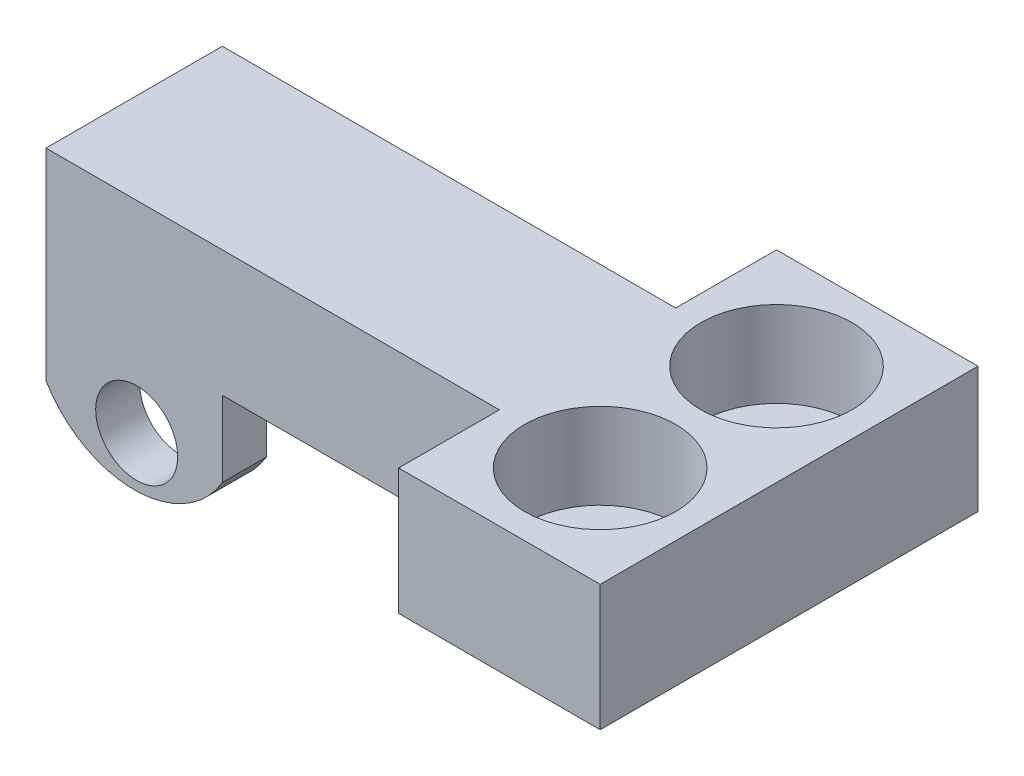
ISO-10303-21;
HEADER;
FILE_DESCRIPTION(('STEP AP214'),'2;1');
FILE_NAME('part.step','',(''),(''),'','','');
FILE_SCHEMA(('AUTOMOTIVE_DESIGN { 1 0 10303 214 1 1 1 1 }'));
ENDSEC;
DATA;
#1=APPLICATION_CONTEXT('core data for automotive mechanical design processes');
#2=APPLICATION_PROTOCOL_DEFINITION('international standard','automotive_design',2000,#1);
#3=PRODUCT_CONTEXT('',#1,'mechanical');
#4=PRODUCT('Part','Part','',(#3));
#5=PRODUCT_RELATED_PRODUCT_CATEGORY('part','',(#4));
#6=PRODUCT_DEFINITION_FORMATION('','',#4);
#7=PRODUCT_DEFINITION_CONTEXT('part definition',#1,'design');
#8=PRODUCT_DEFINITION('design','',#6,#7);
#9=PRODUCT_DEFINITION_SHAPE('','',#8);
#10=(LENGTH_UNIT() NAMED_UNIT(*) SI_UNIT(.MILLI.,.METRE.));
#11=(NAMED_UNIT(*) PLANE_ANGLE_UNIT() SI_UNIT($,.RADIAN.));
#12=(NAMED_UNIT(*) SI_UNIT($,.STERADIAN.) SOLID_ANGLE_UNIT());
#13=UNCERTAINTY_MEASURE_WITH_UNIT(LENGTH_MEASURE(1.E-05),#10,'distance_accuracy_value','');
#14=(GEOMETRIC_REPRESENTATION_CONTEXT(3) GLOBAL_UNCERTAINTY_ASSIGNED_CONTEXT((#13)) GLOBAL_UNIT_ASSIGNED_CONTEXT((#10,
#11,#12)) REPRESENTATION_CONTEXT('',''));
#15=CARTESIAN_POINT('',(0.,0.,0.));
#16=DIRECTION('',(0.,0.,1.));
#17=DIRECTION('',(1.,0.,0.));
#18=AXIS2_PLACEMENT_3D('',#15,#16,#17);
#19=CARTESIAN_POINT('',(-26.,0.,15.));
#20=DIRECTION('',(1.,0.,0.));
#21=DIRECTION('',(0.,0.,-1.));
#22=AXIS2_PLACEMENT_3D('',#19,#20,#21);
#23=PLANE('',#22);
#24=DIRECTION('',(0.,0.,-1.));
#25=VECTOR('',#24,1.);
#26=CARTESIAN_POINT('',(-26.,-3.00000000000001,15.));
#27=LINE('',#26,#25);
#28=CARTESIAN_POINT('',(-26.,-3.,11.));
#29=VERTEX_POINT('',#28);
#30=CARTESIAN_POINT('',(-26.,-3.00000000000001,9.25));
#31=VERTEX_POINT('',#30);
#32=EDGE_CURVE('E188',#29,#31,#27,.T.);
#33=ORIENTED_EDGE('',*,*,#32,.F.);
#34=DIRECTION('',(0.,-1.,0.));
#35=VECTOR('',#34,1.);
#36=CARTESIAN_POINT('',(-26.,5.,11.));
#37=LINE('',#36,#35);
#38=CARTESIAN_POINT('',(-26.,5.,11.));
#39=VERTEX_POINT('',#38);
#40=EDGE_CURVE('E148',#39,#29,#37,.T.);
#41=ORIENTED_EDGE('',*,*,#40,.F.);
#42=DIRECTION('',(0.,0.,-1.));
#43=VECTOR('',#42,1.);
#44=CARTESIAN_POINT('',(-26.,5.,15.));
#45=LINE('',#44,#43);
#46=CARTESIAN_POINT('',(-26.,5.,4.));
#47=VERTEX_POINT('',#46);
#48=EDGE_CURVE('E190',#39,#47,#45,.T.);
#49=ORIENTED_EDGE('',*,*,#48,.T.);
#50=DIRECTION('',(0.,-1.,0.));
#51=VECTOR('',#50,1.);
#52=CARTESIAN_POINT('',(-26.,5.,4.));
#53=LINE('',#52,#51);
#54=CARTESIAN_POINT('',(-26.,-3.00000000000001,4.));
#55=VERTEX_POINT('',#54);
#56=EDGE_CURVE('E237',#47,#55,#53,.T.);
#57=ORIENTED_EDGE('',*,*,#56,.T.);
#58=CARTESIAN_POINT('',(-26.,-3.00000000000001,5.75));
#59=VERTEX_POINT('',#58);
#60=EDGE_CURVE('E187',#59,#55,#27,.T.);
#61=ORIENTED_EDGE('',*,*,#60,.F.);
#62=DIRECTION('',(0.,1.,0.));
#63=VECTOR('',#62,1.);
#64=CARTESIAN_POINT('',(-26.,-5.,5.75));
#65=LINE('',#64,#63);
#66=CARTESIAN_POINT('',(-26.,0.,5.75));
#67=VERTEX_POINT('',#66);
#68=EDGE_CURVE('E200',#59,#67,#65,.T.);
#69=ORIENTED_EDGE('',*,*,#68,.T.);
#70=DIRECTION('',(0.,0.,-1.));
#71=VECTOR('',#70,1.);
#72=CARTESIAN_POINT('',(-26.,0.,5.75));
#73=LINE('',#72,#71);
#74=CARTESIAN_POINT('',(-26.,0.,9.25));
#75=VERTEX_POINT('',#74);
#76=EDGE_CURVE('E254',#75,#67,#73,.T.);
#77=ORIENTED_EDGE('',*,*,#76,.F.);
#78=DIRECTION('',(0.,1.,0.));
#79=VECTOR('',#78,1.);
#80=CARTESIAN_POINT('',(-26.,-5.,9.25));
#81=LINE('',#80,#79);
#82=EDGE_CURVE('E262',#31,#75,#81,.T.);
#83=ORIENTED_EDGE('',*,*,#82,.F.);
#84=EDGE_LOOP('',(#33,#41,#49,#57,#61,#69,#77,#83));
#85=FACE_BOUND('',#84,.T.);
#86=ADVANCED_FACE('F36',(#85),#23,.F.);
#87=CARTESIAN_POINT('',(-22.5,-0.937500000000003,15.));
#88=DIRECTION('',(0.,0.,-1.));
#89=DIRECTION('',(-1.,0.,0.));
#90=AXIS2_PLACEMENT_3D('',#87,#88,#89);
#91=CYLINDRICAL_SURFACE('',#90,4.0625);
#92=ORIENTED_EDGE('',*,*,#60,.T.);
#93=CARTESIAN_POINT('',(-22.5,-0.937500000000003,4.));
#94=DIRECTION('',(0.,0.,1.));
#95=DIRECTION('',(1.,0.,0.));
#96=AXIS2_PLACEMENT_3D('',#93,#94,#95);
#97=CIRCLE('',#96,4.0625);
#98=CARTESIAN_POINT('',(-19.,-3.,4.));
#99=VERTEX_POINT('',#98);
#100=EDGE_CURVE('E243',#55,#99,#97,.T.);
#101=ORIENTED_EDGE('',*,*,#100,.T.);
#102=DIRECTION('',(0.,0.,-1.));
#103=VECTOR('',#102,1.);
#104=CARTESIAN_POINT('',(-19.,-3.,15.));
#105=LINE('',#104,#103);
#106=CARTESIAN_POINT('',(-19.,-3.,5.75));
#107=VERTEX_POINT('',#106);
#108=EDGE_CURVE('E184',#107,#99,#105,.T.);
#109=ORIENTED_EDGE('',*,*,#108,.F.);
#110=CARTESIAN_POINT('',(-22.5,-0.937500000000003,5.75));
#111=DIRECTION('',(0.,0.,1.));
#112=DIRECTION('',(1.,0.,0.));
#113=AXIS2_PLACEMENT_3D('',#110,#111,#112);
#114=CIRCLE('',#113,4.0625);
#115=EDGE_CURVE('E175',#59,#107,#114,.T.);
#116=ORIENTED_EDGE('',*,*,#115,.F.);
#117=EDGE_LOOP('',(#92,#101,#109,#116));
#118=FACE_BOUND('',#117,.T.);
#119=ADVANCED_FACE('F286',(#118),#91,.T.);
#120=CARTESIAN_POINT('',(-19.,-3.,11.));
#121=VERTEX_POINT('',#120);
#122=CARTESIAN_POINT('',(-19.,-3.,9.25));
#123=VERTEX_POINT('',#122);
#124=EDGE_CURVE('E185',#121,#123,#105,.T.);
#125=ORIENTED_EDGE('',*,*,#124,.F.);
#126=CARTESIAN_POINT('',(-22.5,-0.937500000000003,11.));
#127=DIRECTION('',(0.,0.,-1.));
#128=DIRECTION('',(-1.,0.,0.));
#129=AXIS2_PLACEMENT_3D('',#126,#127,#128);
#130=CIRCLE('',#129,4.0625);
#131=EDGE_CURVE('E249',#121,#29,#130,.T.);
#132=ORIENTED_EDGE('',*,*,#131,.T.);
#133=ORIENTED_EDGE('',*,*,#32,.T.);
#134=CARTESIAN_POINT('',(-22.5,-0.937500000000003,9.25));
#135=DIRECTION('',(0.,0.,-1.));
#136=DIRECTION('',(-1.,0.,0.));
#137=AXIS2_PLACEMENT_3D('',#134,#135,#136);
#138=CIRCLE('',#137,4.0625);
#139=EDGE_CURVE('E199',#123,#31,#138,.T.);
#140=ORIENTED_EDGE('',*,*,#139,.F.);
#141=EDGE_LOOP('',(#125,#132,#133,#140));
#142=FACE_BOUND('',#141,.T.);
#143=ADVANCED_FACE('F318',(#142),#91,.T.);
#144=CARTESIAN_POINT('',(-19.,0.,15.));
#145=DIRECTION('',(-1.,0.,0.));
#146=DIRECTION('',(0.,0.,1.));
#147=AXIS2_PLACEMENT_3D('',#144,#145,#146);
#148=PLANE('',#147);
#149=ORIENTED_EDGE('',*,*,#108,.T.);
#150=DIRECTION('',(0.,1.,0.));
#151=VECTOR('',#150,1.);
#152=CARTESIAN_POINT('',(-19.,0.,4.));
#153=LINE('',#152,#151);
#154=CARTESIAN_POINT('',(-19.,0.,4.));
#155=VERTEX_POINT('',#154);
#156=EDGE_CURVE('E231',#99,#155,#153,.T.);
#157=ORIENTED_EDGE('',*,*,#156,.T.);
#158=DIRECTION('',(0.,0.,-1.));
#159=VECTOR('',#158,1.);
#160=CARTESIAN_POINT('',(-19.,0.,15.));
#161=LINE('',#160,#159);
#162=CARTESIAN_POINT('',(-19.,0.,5.75));
#163=VERTEX_POINT('',#162);
#164=EDGE_CURVE('E181',#163,#155,#161,.T.);
#165=ORIENTED_EDGE('',*,*,#164,.F.);
#166=DIRECTION('',(0.,1.,0.));
#167=VECTOR('',#166,1.);
#168=CARTESIAN_POINT('',(-19.,-5.,5.75));
#169=LINE('',#168,#167);
#170=EDGE_CURVE('E267',#107,#163,#169,.T.);
#171=ORIENTED_EDGE('',*,*,#170,.F.);
#172=EDGE_LOOP('',(#149,#157,#165,#171));
#173=FACE_BOUND('',#172,.T.);
#174=ADVANCED_FACE('F284',(#173),#148,.F.);
#175=CARTESIAN_POINT('',(-19.,0.,11.));
#176=VERTEX_POINT('',#175);
#177=CARTESIAN_POINT('',(-19.,0.,9.25));
#178=VERTEX_POINT('',#177);
#179=EDGE_CURVE('E182',#176,#178,#161,.T.);
#180=ORIENTED_EDGE('',*,*,#179,.F.);
#181=DIRECTION('',(0.,-1.,0.));
#182=VECTOR('',#181,1.);
#183=CARTESIAN_POINT('',(-19.,0.,11.));
#184=LINE('',#183,#182);
#185=EDGE_CURVE('E61',#176,#121,#184,.T.);
#186=ORIENTED_EDGE('',*,*,#185,.T.);
#187=ORIENTED_EDGE('',*,*,#124,.T.);
#188=DIRECTION('',(0.,1.,0.));
#189=VECTOR('',#188,1.);
#190=CARTESIAN_POINT('',(-19.,-5.,9.25));
#191=LINE('',#190,#189);
#192=EDGE_CURVE('E264',#123,#178,#191,.T.);
#193=ORIENTED_EDGE('',*,*,#192,.T.);
#194=EDGE_LOOP('',(#180,#186,#187,#193));
#195=FACE_BOUND('',#194,.T.);
#196=ADVANCED_FACE('F323',(#195),#148,.F.);
#197=CARTESIAN_POINT('',(-22.4,-3.,15.));
#198=DIRECTION('',(0.,0.,-1.));
#199=DIRECTION('',(-1.,0.,0.));
#200=AXIS2_PLACEMENT_3D('',#197,#198,#199);
#201=CYLINDRICAL_SURFACE('',#200,1.62849757347407);
#202=CARTESIAN_POINT('',(-22.4,-3.,4.));
#203=DIRECTION('',(0.,0.,1.));
#204=DIRECTION('',(1.,0.,0.));
#205=AXIS2_PLACEMENT_3D('',#202,#203,#204);
#206=CIRCLE('',#205,1.62849757347407);
#207=CARTESIAN_POINT('',(-20.7715024265259,-3.,4.));
#208=VERTEX_POINT('',#207);
#209=EDGE_CURVE('E245',#208,#208,#206,.T.);
#210=ORIENTED_EDGE('',*,*,#209,.F.);
#211=EDGE_LOOP('',(#210));
#212=FACE_BOUND('',#211,.T.);
#213=CARTESIAN_POINT('',(-22.4,-3.,5.75));
#214=DIRECTION('',(0.,0.,1.));
#215=DIRECTION('',(1.,0.,0.));
#216=AXIS2_PLACEMENT_3D('',#213,#214,#215);
#217=CIRCLE('',#216,1.62849757347407);
#218=CARTESIAN_POINT('',(-20.7715024265259,-3.,5.75));
#219=VERTEX_POINT('',#218);
#220=EDGE_CURVE('E201',#219,#219,#217,.T.);
#221=ORIENTED_EDGE('',*,*,#220,.T.);
#222=EDGE_LOOP('',(#221));
#223=FACE_BOUND('',#222,.T.);
#224=ADVANCED_FACE('F330',(#212,#223),#201,.F.);
#225=CARTESIAN_POINT('',(-22.4,-3.,11.));
#226=DIRECTION('',(0.,0.,-1.));
#227=DIRECTION('',(-1.,0.,0.));
#228=AXIS2_PLACEMENT_3D('',#225,#226,#227);
#229=CIRCLE('',#228,1.62849757347407);
#230=CARTESIAN_POINT('',(-24.0284975734741,-3.,11.));
#231=VERTEX_POINT('',#230);
#232=EDGE_CURVE('E251',#231,#231,#229,.T.);
#233=ORIENTED_EDGE('',*,*,#232,.F.);
#234=EDGE_LOOP('',(#233));
#235=FACE_BOUND('',#234,.T.);
#236=CARTESIAN_POINT('',(-22.4,-3.,9.25));
#237=DIRECTION('',(0.,0.,-1.));
#238=DIRECTION('',(-1.,0.,0.));
#239=AXIS2_PLACEMENT_3D('',#236,#237,#238);
#240=CIRCLE('',#239,1.62849757347407);
#241=CARTESIAN_POINT('',(-24.0284975734741,-3.,9.25));
#242=VERTEX_POINT('',#241);
#243=EDGE_CURVE('E196',#242,#242,#240,.T.);
#244=ORIENTED_EDGE('',*,*,#243,.T.);
#245=EDGE_LOOP('',(#244));
#246=FACE_BOUND('',#245,.T.);
#247=ADVANCED_FACE('F329',(#235,#246),#201,.F.);
#248=CARTESIAN_POINT('',(-22.5,-0.937500000000003,15.));
#249=DIRECTION('',(0.,0.,-1.));
#250=DIRECTION('',(-1.,0.,0.));
#251=AXIS2_PLACEMENT_3D('',#248,#249,#250);
#252=PLANE('',#251);
#253=DIRECTION('',(-1.,0.,0.));
#254=VECTOR('',#253,1.);
#255=CARTESIAN_POINT('',(0.,5.,15.));
#256=LINE('',#255,#254);
#257=CARTESIAN_POINT('',(0.,5.,15.));
#258=VERTEX_POINT('',#257);
#259=CARTESIAN_POINT('',(-8.,5.,15.));
#260=VERTEX_POINT('',#259);
#261=EDGE_CURVE('E154',#258,#260,#256,.T.);
#262=ORIENTED_EDGE('',*,*,#261,.T.);
#263=DIRECTION('',(0.,-1.,0.));
#264=VECTOR('',#263,1.);
#265=CARTESIAN_POINT('',(-8.,5.,15.));
#266=LINE('',#265,#264);
#267=CARTESIAN_POINT('',(-8.,0.,15.));
#268=VERTEX_POINT('',#267);
#269=EDGE_CURVE('E139',#260,#268,#266,.T.);
#270=ORIENTED_EDGE('',*,*,#269,.T.);
#271=DIRECTION('',(1.,0.,0.));
#272=VECTOR('',#271,1.);
#273=CARTESIAN_POINT('',(0.,0.,15.));
#274=LINE('',#273,#272);
#275=CARTESIAN_POINT('',(0.,0.,15.));
#276=VERTEX_POINT('',#275);
#277=EDGE_CURVE('E163',#268,#276,#274,.T.);
#278=ORIENTED_EDGE('',*,*,#277,.T.);
#279=DIRECTION('',(0.,1.,0.));
#280=VECTOR('',#279,1.);
#281=CARTESIAN_POINT('',(0.,0.,15.));
#282=LINE('',#281,#280);
#283=EDGE_CURVE('E161',#276,#258,#282,.T.);
#284=ORIENTED_EDGE('',*,*,#283,.T.);
#285=EDGE_LOOP('',(#262,#270,#278,#284));
#286=FACE_BOUND('',#285,.T.);
#287=ADVANCED_FACE('F159',(#286),#252,.F.);
#288=CARTESIAN_POINT('',(-22.5,-0.937500000000003,0.));
#289=DIRECTION('',(0.,0.,-1.));
#290=DIRECTION('',(-1.,0.,0.));
#291=AXIS2_PLACEMENT_3D('',#288,#289,#290);
#292=PLANE('',#291);
#293=DIRECTION('',(0.,-1.,0.));
#294=VECTOR('',#293,1.);
#295=CARTESIAN_POINT('',(-8.,5.,0.));
#296=LINE('',#295,#294);
#297=CARTESIAN_POINT('',(-8.,5.,0.));
#298=VERTEX_POINT('',#297);
#299=CARTESIAN_POINT('',(-8.,0.,0.));
#300=VERTEX_POINT('',#299);
#301=EDGE_CURVE('E157',#298,#300,#296,.T.);
#302=ORIENTED_EDGE('',*,*,#301,.F.);
#303=DIRECTION('',(-1.,0.,0.));
#304=VECTOR('',#303,1.);
#305=CARTESIAN_POINT('',(0.,5.,0.));
#306=LINE('',#305,#304);
#307=CARTESIAN_POINT('',(0.,5.,0.));
#308=VERTEX_POINT('',#307);
#309=EDGE_CURVE('E174',#308,#298,#306,.T.);
#310=ORIENTED_EDGE('',*,*,#309,.F.);
#311=DIRECTION('',(0.,1.,0.));
#312=VECTOR('',#311,1.);
#313=CARTESIAN_POINT('',(0.,0.,0.));
#314=LINE('',#313,#312);
#315=CARTESIAN_POINT('',(0.,0.,0.));
#316=VERTEX_POINT('',#315);
#317=EDGE_CURVE('E171',#316,#308,#314,.T.);
#318=ORIENTED_EDGE('',*,*,#317,.F.);
#319=DIRECTION('',(1.,0.,0.));
#320=VECTOR('',#319,1.);
#321=CARTESIAN_POINT('',(0.,0.,0.));
#322=LINE('',#321,#320);
#323=EDGE_CURVE('E167',#300,#316,#322,.T.);
#324=ORIENTED_EDGE('',*,*,#323,.F.);
#325=EDGE_LOOP('',(#302,#310,#318,#324));
#326=FACE_BOUND('',#325,.T.);
#327=ADVANCED_FACE('F302',(#326),#292,.T.);
#328=CARTESIAN_POINT('',(0.,0.,15.));
#329=DIRECTION('',(-1.,0.,0.));
#330=DIRECTION('',(0.,0.,1.));
#331=AXIS2_PLACEMENT_3D('',#328,#329,#330);
#332=PLANE('',#331);
#333=ORIENTED_EDGE('',*,*,#317,.T.);
#334=DIRECTION('',(0.,0.,-1.));
#335=VECTOR('',#334,1.);
#336=CARTESIAN_POINT('',(0.,5.,15.));
#337=LINE('',#336,#335);
#338=EDGE_CURVE('E193',#258,#308,#337,.T.);
#339=ORIENTED_EDGE('',*,*,#338,.F.);
#340=ORIENTED_EDGE('',*,*,#283,.F.);
#341=DIRECTION('',(0.,0.,-1.));
#342=VECTOR('',#341,1.);
#343=CARTESIAN_POINT('',(0.,0.,15.));
#344=LINE('',#343,#342);
#345=EDGE_CURVE('E165',#276,#316,#344,.T.);
#346=ORIENTED_EDGE('',*,*,#345,.T.);
#347=EDGE_LOOP('',(#333,#339,#340,#346));
#348=FACE_BOUND('',#347,.T.);
#349=ADVANCED_FACE('F38',(#348),#332,.F.);
#350=CARTESIAN_POINT('',(0.,5.,15.));
#351=DIRECTION('',(0.,-1.,0.));
#352=DIRECTION('',(1.,0.,0.));
#353=AXIS2_PLACEMENT_3D('',#350,#351,#352);
#354=PLANE('',#353);
#355=CARTESIAN_POINT('',(-4.,5.,4.));
#356=DIRECTION('',(0.,1.,0.));
#357=DIRECTION('',(0.,0.,1.));
#358=AXIS2_PLACEMENT_3D('',#355,#356,#357);
#359=CIRCLE('',#358,3.);
#360=CARTESIAN_POINT('',(-4.,5.,7.));
#361=VERTEX_POINT('',#360);
#362=EDGE_CURVE('E382',#361,#361,#359,.T.);
#363=ORIENTED_EDGE('',*,*,#362,.F.);
#364=EDGE_LOOP('',(#363));
#365=FACE_BOUND('',#364,.T.);
#366=CARTESIAN_POINT('',(-4.,5.,11.));
#367=DIRECTION('',(0.,1.,0.));
#368=DIRECTION('',(0.,0.,1.));
#369=AXIS2_PLACEMENT_3D('',#366,#367,#368);
#370=CIRCLE('',#369,3.);
#371=CARTESIAN_POINT('',(-4.,5.,14.));
#372=VERTEX_POINT('',#371);
#373=EDGE_CURVE('E224',#372,#372,#370,.T.);
#374=ORIENTED_EDGE('',*,*,#373,.F.);
#375=EDGE_LOOP('',(#374));
#376=FACE_BOUND('',#375,.T.);
#377=DIRECTION('',(1.,0.,0.));
#378=VECTOR('',#377,1.);
#379=CARTESIAN_POINT('',(-26.,5.,11.));
#380=LINE('',#379,#378);
#381=CARTESIAN_POINT('',(-8.,5.,11.));
#382=VERTEX_POINT('',#381);
#383=EDGE_CURVE('E149',#39,#382,#380,.T.);
#384=ORIENTED_EDGE('',*,*,#383,.T.);
#385=DIRECTION('',(0.,0.,1.));
#386=VECTOR('',#385,1.);
#387=CARTESIAN_POINT('',(-8.,5.,15.));
#388=LINE('',#387,#386);
#389=EDGE_CURVE('E143',#382,#260,#388,.T.);
#390=ORIENTED_EDGE('',*,*,#389,.T.);
#391=ORIENTED_EDGE('',*,*,#261,.F.);
#392=ORIENTED_EDGE('',*,*,#338,.T.);
#393=ORIENTED_EDGE('',*,*,#309,.T.);
#394=DIRECTION('',(0.,0.,1.));
#395=VECTOR('',#394,1.);
#396=CARTESIAN_POINT('',(-8.,5.,0.));
#397=LINE('',#396,#395);
#398=CARTESIAN_POINT('',(-8.,5.,4.));
#399=VERTEX_POINT('',#398);
#400=EDGE_CURVE('E211',#298,#399,#397,.T.);
#401=ORIENTED_EDGE('',*,*,#400,.T.);
#402=DIRECTION('',(-1.,0.,0.));
#403=VECTOR('',#402,1.);
#404=CARTESIAN_POINT('',(-26.,5.,4.));
#405=LINE('',#404,#403);
#406=EDGE_CURVE('E216',#399,#47,#405,.T.);
#407=ORIENTED_EDGE('',*,*,#406,.T.);
#408=ORIENTED_EDGE('',*,*,#48,.F.);
#409=EDGE_LOOP('',(#384,#390,#391,#392,#393,#401,#407,#408));
#410=FACE_BOUND('',#409,.T.);
#411=ADVANCED_FACE('F152',(#365,#376,#410),#354,.F.);
#412=CARTESIAN_POINT('',(0.,0.,15.));
#413=DIRECTION('',(0.,1.,0.));
#414=DIRECTION('',(-1.,0.,0.));
#415=AXIS2_PLACEMENT_3D('',#412,#413,#414);
#416=PLANE('',#415);
#417=CARTESIAN_POINT('',(-4.,0.,4.));
#418=DIRECTION('',(0.,1.,0.));
#419=DIRECTION('',(-1.,0.,0.));
#420=AXIS2_PLACEMENT_3D('',#417,#418,#419);
#421=CIRCLE('',#420,1.7);
#422=CARTESIAN_POINT('',(-5.7,0.,4.));
#423=VERTEX_POINT('',#422);
#424=EDGE_CURVE('E40',#423,#423,#421,.T.);
#425=ORIENTED_EDGE('',*,*,#424,.T.);
#426=EDGE_LOOP('',(#425));
#427=FACE_BOUND('',#426,.T.);
#428=CARTESIAN_POINT('',(-4.,0.,11.));
#429=DIRECTION('',(0.,1.,0.));
#430=DIRECTION('',(-1.,0.,0.));
#431=AXIS2_PLACEMENT_3D('',#428,#429,#430);
#432=CIRCLE('',#431,1.7);
#433=CARTESIAN_POINT('',(-5.7,0.,11.));
#434=VERTEX_POINT('',#433);
#435=EDGE_CURVE('E209',#434,#434,#432,.T.);
#436=ORIENTED_EDGE('',*,*,#435,.T.);
#437=EDGE_LOOP('',(#436));
#438=FACE_BOUND('',#437,.T.);
#439=ORIENTED_EDGE('',*,*,#277,.F.);
#440=DIRECTION('',(0.,0.,-1.));
#441=VECTOR('',#440,1.);
#442=CARTESIAN_POINT('',(-8.,0.,15.));
#443=LINE('',#442,#441);
#444=CARTESIAN_POINT('',(-8.,0.,11.));
#445=VERTEX_POINT('',#444);
#446=EDGE_CURVE('E11',#268,#445,#443,.T.);
#447=ORIENTED_EDGE('',*,*,#446,.T.);
#448=DIRECTION('',(-1.,0.,0.));
#449=VECTOR('',#448,1.);
#450=CARTESIAN_POINT('',(0.,0.,11.));
#451=LINE('',#450,#449);
#452=EDGE_CURVE('E45',#445,#176,#451,.T.);
#453=ORIENTED_EDGE('',*,*,#452,.T.);
#454=ORIENTED_EDGE('',*,*,#179,.T.);
#455=DIRECTION('',(-1.,0.,0.));
#456=VECTOR('',#455,1.);
#457=CARTESIAN_POINT('',(-19.,0.,9.25));
#458=LINE('',#457,#456);
#459=EDGE_CURVE('E259',#178,#75,#458,.T.);
#460=ORIENTED_EDGE('',*,*,#459,.T.);
#461=ORIENTED_EDGE('',*,*,#76,.T.);
#462=DIRECTION('',(1.,0.,0.));
#463=VECTOR('',#462,1.);
#464=CARTESIAN_POINT('',(-19.,0.,5.75));
#465=LINE('',#464,#463);
#466=EDGE_CURVE('E257',#67,#163,#465,.T.);
#467=ORIENTED_EDGE('',*,*,#466,.T.);
#468=ORIENTED_EDGE('',*,*,#164,.T.);
#469=DIRECTION('',(1.,0.,0.));
#470=VECTOR('',#469,1.);
#471=CARTESIAN_POINT('',(0.,0.,4.));
#472=LINE('',#471,#470);
#473=CARTESIAN_POINT('',(-8.,0.,4.));
#474=VERTEX_POINT('',#473);
#475=EDGE_CURVE('E195',#155,#474,#472,.T.);
#476=ORIENTED_EDGE('',*,*,#475,.T.);
#477=DIRECTION('',(0.,0.,-1.));
#478=VECTOR('',#477,1.);
#479=CARTESIAN_POINT('',(-7.99999999999999,0.,15.));
#480=LINE('',#479,#478);
#481=EDGE_CURVE('E206',#474,#300,#480,.T.);
#482=ORIENTED_EDGE('',*,*,#481,.T.);
#483=ORIENTED_EDGE('',*,*,#323,.T.);
#484=ORIENTED_EDGE('',*,*,#345,.F.);
#485=EDGE_LOOP('',(#439,#447,#453,#454,#460,#461,#467,#468,#476,#482,#483,#484));
#486=FACE_BOUND('',#485,.T.);
#487=ADVANCED_FACE('F290',(#427,#438,#486),#416,.F.);
#488=CARTESIAN_POINT('',(-19.,-5.,5.75));
#489=DIRECTION('',(0.,0.,1.));
#490=DIRECTION('',(1.,0.,0.));
#491=AXIS2_PLACEMENT_3D('',#488,#489,#490);
#492=PLANE('',#491);
#493=ORIENTED_EDGE('',*,*,#220,.F.);
#494=EDGE_LOOP('',(#493));
#495=FACE_BOUND('',#494,.T.);
#496=ORIENTED_EDGE('',*,*,#115,.T.);
#497=ORIENTED_EDGE('',*,*,#170,.T.);
#498=ORIENTED_EDGE('',*,*,#466,.F.);
#499=ORIENTED_EDGE('',*,*,#68,.F.);
#500=EDGE_LOOP('',(#496,#497,#498,#499));
#501=FACE_BOUND('',#500,.T.);
#502=ADVANCED_FACE('F276',(#495,#501),#492,.T.);
#503=CARTESIAN_POINT('',(-19.,-5.,9.25));
#504=DIRECTION('',(0.,0.,-1.));
#505=DIRECTION('',(-1.,0.,0.));
#506=AXIS2_PLACEMENT_3D('',#503,#504,#505);
#507=PLANE('',#506);
#508=ORIENTED_EDGE('',*,*,#243,.F.);
#509=EDGE_LOOP('',(#508));
#510=FACE_BOUND('',#509,.T.);
#511=ORIENTED_EDGE('',*,*,#139,.T.);
#512=ORIENTED_EDGE('',*,*,#82,.T.);
#513=ORIENTED_EDGE('',*,*,#459,.F.);
#514=ORIENTED_EDGE('',*,*,#192,.F.);
#515=EDGE_LOOP('',(#511,#512,#513,#514));
#516=FACE_BOUND('',#515,.T.);
#517=ADVANCED_FACE('F336',(#510,#516),#507,.T.);
#518=CARTESIAN_POINT('',(-8.,5.,0.));
#519=DIRECTION('',(1.,0.,0.));
#520=DIRECTION('',(0.,0.,-1.));
#521=AXIS2_PLACEMENT_3D('',#518,#519,#520);
#522=PLANE('',#521);
#523=DIRECTION('',(0.,-1.,0.));
#524=VECTOR('',#523,1.);
#525=CARTESIAN_POINT('',(-8.,5.,4.));
#526=LINE('',#525,#524);
#527=EDGE_CURVE('E53',#399,#474,#526,.T.);
#528=ORIENTED_EDGE('',*,*,#527,.F.);
#529=ORIENTED_EDGE('',*,*,#400,.F.);
#530=ORIENTED_EDGE('',*,*,#301,.T.);
#531=ORIENTED_EDGE('',*,*,#481,.F.);
#532=EDGE_LOOP('',(#528,#529,#530,#531));
#533=FACE_BOUND('',#532,.T.);
#534=ADVANCED_FACE('F299',(#533),#522,.F.);
#535=CARTESIAN_POINT('',(-26.,5.,4.));
#536=DIRECTION('',(0.,0.,1.));
#537=DIRECTION('',(1.,0.,0.));
#538=AXIS2_PLACEMENT_3D('',#535,#536,#537);
#539=PLANE('',#538);
#540=ORIENTED_EDGE('',*,*,#209,.T.);
#541=EDGE_LOOP('',(#540));
#542=FACE_BOUND('',#541,.T.);
#543=ORIENTED_EDGE('',*,*,#56,.F.);
#544=ORIENTED_EDGE('',*,*,#406,.F.);
#545=ORIENTED_EDGE('',*,*,#527,.T.);
#546=ORIENTED_EDGE('',*,*,#475,.F.);
#547=ORIENTED_EDGE('',*,*,#156,.F.);
#548=ORIENTED_EDGE('',*,*,#100,.F.);
#549=EDGE_LOOP('',(#543,#544,#545,#546,#547,#548));
#550=FACE_BOUND('',#549,.T.);
#551=ADVANCED_FACE('F288',(#542,#550),#539,.F.);
#552=CARTESIAN_POINT('',(-8.,5.,15.));
#553=DIRECTION('',(1.,0.,0.));
#554=DIRECTION('',(0.,1.,0.));
#555=AXIS2_PLACEMENT_3D('',#552,#553,#554);
#556=PLANE('',#555);
#557=ORIENTED_EDGE('',*,*,#269,.F.);
#558=ORIENTED_EDGE('',*,*,#389,.F.);
#559=DIRECTION('',(0.,-1.,0.));
#560=VECTOR('',#559,1.);
#561=CARTESIAN_POINT('',(-8.,5.,11.));
#562=LINE('',#561,#560);
#563=EDGE_CURVE('E229',#382,#445,#562,.T.);
#564=ORIENTED_EDGE('',*,*,#563,.T.);
#565=ORIENTED_EDGE('',*,*,#446,.F.);
#566=EDGE_LOOP('',(#557,#558,#564,#565));
#567=FACE_BOUND('',#566,.T.);
#568=ADVANCED_FACE('F141',(#567),#556,.F.);
#569=CARTESIAN_POINT('',(-26.,5.,11.));
#570=DIRECTION('',(0.,0.,-1.));
#571=DIRECTION('',(-1.,0.,0.));
#572=AXIS2_PLACEMENT_3D('',#569,#570,#571);
#573=PLANE('',#572);
#574=ORIENTED_EDGE('',*,*,#232,.T.);
#575=EDGE_LOOP('',(#574));
#576=FACE_BOUND('',#575,.T.);
#577=ORIENTED_EDGE('',*,*,#131,.F.);
#578=ORIENTED_EDGE('',*,*,#185,.F.);
#579=ORIENTED_EDGE('',*,*,#452,.F.);
#580=ORIENTED_EDGE('',*,*,#563,.F.);
#581=ORIENTED_EDGE('',*,*,#383,.F.);
#582=ORIENTED_EDGE('',*,*,#40,.T.);
#583=EDGE_LOOP('',(#577,#578,#579,#580,#581,#582));
#584=FACE_BOUND('',#583,.T.);
#585=ADVANCED_FACE('F348',(#576,#584),#573,.F.);
#586=CARTESIAN_POINT('',(-4.,5.,11.));
#587=DIRECTION('',(0.,1.,0.));
#588=DIRECTION('',(0.,0.,1.));
#589=AXIS2_PLACEMENT_3D('',#586,#587,#588);
#590=CYLINDRICAL_SURFACE('',#589,1.7);
#591=CARTESIAN_POINT('',(-4.,1.6,11.));
#592=DIRECTION('',(0.,1.,0.));
#593=DIRECTION('',(0.,0.,1.));
#594=AXIS2_PLACEMENT_3D('',#591,#592,#593);
#595=CIRCLE('',#594,1.7);
#596=CARTESIAN_POINT('',(-4.,1.6,12.7));
#597=VERTEX_POINT('',#596);
#598=EDGE_CURVE('E212',#597,#597,#595,.T.);
#599=ORIENTED_EDGE('',*,*,#598,.T.);
#600=EDGE_LOOP('',(#599));
#601=FACE_BOUND('',#600,.T.);
#602=ORIENTED_EDGE('',*,*,#435,.F.);
#603=EDGE_LOOP('',(#602));
#604=FACE_BOUND('',#603,.T.);
#605=ADVANCED_FACE('F351',(#601,#604),#590,.F.);
#606=CARTESIAN_POINT('',(-2.30000000000001,1.6,11.));
#607=DIRECTION('',(0.,-1.,0.));
#608=DIRECTION('',(0.,0.,-1.));
#609=AXIS2_PLACEMENT_3D('',#606,#607,#608);
#610=PLANE('',#609);
#611=ORIENTED_EDGE('',*,*,#598,.F.);
#612=EDGE_LOOP('',(#611));
#613=FACE_BOUND('',#612,.T.);
#614=CARTESIAN_POINT('',(-4.,1.6,11.));
#615=DIRECTION('',(0.,1.,0.));
#616=DIRECTION('',(0.,0.,1.));
#617=AXIS2_PLACEMENT_3D('',#614,#615,#616);
#618=CIRCLE('',#617,3.);
#619=CARTESIAN_POINT('',(-4.,1.6,14.));
#620=VERTEX_POINT('',#619);
#621=EDGE_CURVE('E219',#620,#620,#618,.T.);
#622=ORIENTED_EDGE('',*,*,#621,.T.);
#623=EDGE_LOOP('',(#622));
#624=FACE_BOUND('',#623,.T.);
#625=ADVANCED_FACE('F355',(#613,#624),#610,.F.);
#626=CARTESIAN_POINT('',(-4.,5.,11.));
#627=DIRECTION('',(0.,1.,0.));
#628=DIRECTION('',(0.,0.,1.));
#629=AXIS2_PLACEMENT_3D('',#626,#627,#628);
#630=CYLINDRICAL_SURFACE('',#629,3.);
#631=ORIENTED_EDGE('',*,*,#621,.F.);
#632=EDGE_LOOP('',(#631));
#633=FACE_BOUND('',#632,.T.);
#634=ORIENTED_EDGE('',*,*,#373,.T.);
#635=EDGE_LOOP('',(#634));
#636=FACE_BOUND('',#635,.T.);
#637=ADVANCED_FACE('F358',(#633,#636),#630,.F.);
#638=CARTESIAN_POINT('',(-4.,5.,4.));
#639=DIRECTION('',(0.,1.,0.));
#640=DIRECTION('',(0.,0.,1.));
#641=AXIS2_PLACEMENT_3D('',#638,#639,#640);
#642=CYLINDRICAL_SURFACE('',#641,1.7);
#643=CARTESIAN_POINT('',(-4.,1.6,4.));
#644=DIRECTION('',(0.,1.,0.));
#645=DIRECTION('',(0.,0.,1.));
#646=AXIS2_PLACEMENT_3D('',#643,#644,#645);
#647=CIRCLE('',#646,1.7);
#648=CARTESIAN_POINT('',(-4.,1.6,5.7));
#649=VERTEX_POINT('',#648);
#650=EDGE_CURVE('E384',#649,#649,#647,.T.);
#651=ORIENTED_EDGE('',*,*,#650,.T.);
#652=EDGE_LOOP('',(#651));
#653=FACE_BOUND('',#652,.T.);
#654=ORIENTED_EDGE('',*,*,#424,.F.);
#655=EDGE_LOOP('',(#654));
#656=FACE_BOUND('',#655,.T.);
#657=ADVANCED_FACE('F362',(#653,#656),#642,.F.);
#658=CARTESIAN_POINT('',(-2.30000000000001,1.6,4.));
#659=DIRECTION('',(0.,-1.,0.));
#660=DIRECTION('',(0.,0.,-1.));
#661=AXIS2_PLACEMENT_3D('',#658,#659,#660);
#662=PLANE('',#661);
#663=ORIENTED_EDGE('',*,*,#650,.F.);
#664=EDGE_LOOP('',(#663));
#665=FACE_BOUND('',#664,.T.);
#666=CARTESIAN_POINT('',(-4.,1.6,4.));
#667=DIRECTION('',(0.,1.,0.));
#668=DIRECTION('',(0.,0.,1.));
#669=AXIS2_PLACEMENT_3D('',#666,#667,#668);
#670=CIRCLE('',#669,3.);
#671=CARTESIAN_POINT('',(-4.,1.6,7.));
#672=VERTEX_POINT('',#671);
#673=EDGE_CURVE('E379',#672,#672,#670,.T.);
#674=ORIENTED_EDGE('',*,*,#673,.T.);
#675=EDGE_LOOP('',(#674));
#676=FACE_BOUND('',#675,.T.);
#677=ADVANCED_FACE('F366',(#665,#676),#662,.F.);
#678=CARTESIAN_POINT('',(-4.,5.,4.));
#679=DIRECTION('',(0.,1.,0.));
#680=DIRECTION('',(0.,0.,1.));
#681=AXIS2_PLACEMENT_3D('',#678,#679,#680);
#682=CYLINDRICAL_SURFACE('',#681,3.);
#683=ORIENTED_EDGE('',*,*,#673,.F.);
#684=EDGE_LOOP('',(#683));
#685=FACE_BOUND('',#684,.T.);
#686=ORIENTED_EDGE('',*,*,#362,.T.);
#687=EDGE_LOOP('',(#686));
#688=FACE_BOUND('',#687,.T.);
#689=ADVANCED_FACE('F370',(#685,#688),#682,.F.);
#690=CLOSED_SHELL('',(#86,#119,#143,#174,#196,#224,#247,#287,#327,#349,#411,#487,#502,#517,#534,
#551,#568,#585,#605,#625,#637,#657,#677,#689));
#691=MANIFOLD_SOLID_BREP('B2',#690);
#692=ADVANCED_BREP_SHAPE_REPRESENTATION('',(#18,#691),#14);
#693=SHAPE_DEFINITION_REPRESENTATION(#9,#692);
ENDSEC;
END-ISO-10303-21;
